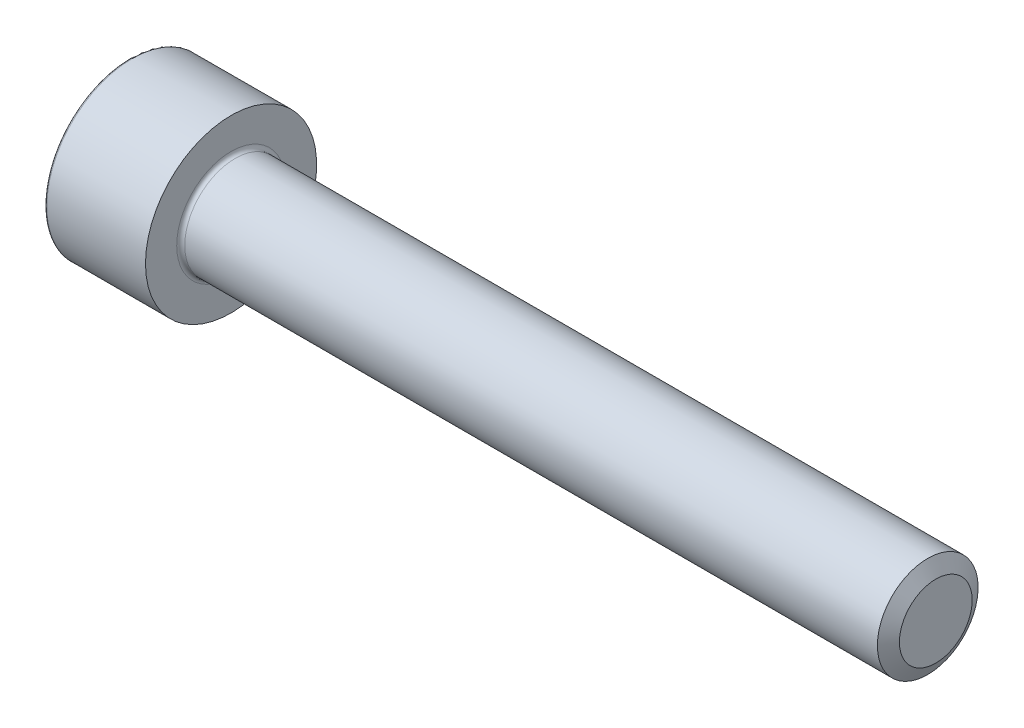
ISO-10303-21;
HEADER;
FILE_DESCRIPTION(('STEP AP214'),'2;1');
FILE_NAME('part.step','',(''),(''),'','','');
FILE_SCHEMA(('AUTOMOTIVE_DESIGN { 1 0 10303 214 1 1 1 1 }'));
ENDSEC;
DATA;
#1=APPLICATION_CONTEXT('core data for automotive mechanical design processes');
#2=APPLICATION_PROTOCOL_DEFINITION('international standard','automotive_design',2000,#1);
#3=PRODUCT_CONTEXT('',#1,'mechanical');
#4=PRODUCT('Part','Part','',(#3));
#5=PRODUCT_RELATED_PRODUCT_CATEGORY('part','',(#4));
#6=PRODUCT_DEFINITION_FORMATION('','',#4);
#7=PRODUCT_DEFINITION_CONTEXT('part definition',#1,'design');
#8=PRODUCT_DEFINITION('design','',#6,#7);
#9=PRODUCT_DEFINITION_SHAPE('','',#8);
#10=(LENGTH_UNIT() NAMED_UNIT(*) SI_UNIT(.MILLI.,.METRE.));
#11=(NAMED_UNIT(*) PLANE_ANGLE_UNIT() SI_UNIT($,.RADIAN.));
#12=(NAMED_UNIT(*) SI_UNIT($,.STERADIAN.) SOLID_ANGLE_UNIT());
#13=UNCERTAINTY_MEASURE_WITH_UNIT(LENGTH_MEASURE(1.E-05),#10,'distance_accuracy_value','');
#14=(GEOMETRIC_REPRESENTATION_CONTEXT(3) GLOBAL_UNCERTAINTY_ASSIGNED_CONTEXT((#13)) GLOBAL_UNIT_ASSIGNED_CONTEXT((#10,
#11,#12)) REPRESENTATION_CONTEXT('',''));
#15=CARTESIAN_POINT('',(0.,0.,0.));
#16=DIRECTION('',(0.,0.,1.));
#17=DIRECTION('',(1.,0.,0.));
#18=AXIS2_PLACEMENT_3D('',#15,#16,#17);
#19=CARTESIAN_POINT('',(0.,0.,0.));
#20=DIRECTION('',(-1.,0.,0.));
#21=DIRECTION('',(0.,0.,1.));
#22=AXIS2_PLACEMENT_3D('',#19,#20,#21);
#23=CYLINDRICAL_SURFACE('',#22,2.5);
#24=CARTESIAN_POINT('',(5.2,0.,0.));
#25=DIRECTION('',(-1.,0.,0.));
#26=DIRECTION('',(0.,0.,1.));
#27=AXIS2_PLACEMENT_3D('',#24,#25,#26);
#28=CIRCLE('',#27,2.5);
#29=CARTESIAN_POINT('',(5.2,0.,2.5));
#30=VERTEX_POINT('',#29);
#31=EDGE_CURVE('E148',#30,#30,#28,.T.);
#32=ORIENTED_EDGE('',*,*,#31,.F.);
#33=EDGE_LOOP('',(#32));
#34=FACE_BOUND('',#33,.T.);
#35=CARTESIAN_POINT('',(39.6000117335054,0.,0.));
#36=DIRECTION('',(-1.,0.,0.));
#37=DIRECTION('',(0.,0.,1.));
#38=AXIS2_PLACEMENT_3D('',#35,#36,#37);
#39=CIRCLE('',#38,2.5);
#40=CARTESIAN_POINT('',(39.6000117335054,0.,2.5));
#41=VERTEX_POINT('',#40);
#42=EDGE_CURVE('E285',#41,#41,#39,.T.);
#43=ORIENTED_EDGE('',*,*,#42,.T.);
#44=EDGE_LOOP('',(#43));
#45=FACE_BOUND('',#44,.T.);
#46=ADVANCED_FACE('F45',(#34,#45),#23,.T.);
#47=CARTESIAN_POINT('',(0.,0.,0.));
#48=DIRECTION('',(1.,0.,0.));
#49=DIRECTION('',(0.,0.,-1.));
#50=AXIS2_PLACEMENT_3D('',#47,#48,#49);
#51=PLANE('',#50);
#52=CARTESIAN_POINT('',(0.,0.,0.));
#53=DIRECTION('',(1.,0.,0.));
#54=DIRECTION('',(0.,0.,-1.));
#55=AXIS2_PLACEMENT_3D('',#52,#53,#54);
#56=CIRCLE('',#55,4.15);
#57=CARTESIAN_POINT('',(0.,0.,-4.15));
#58=VERTEX_POINT('',#57);
#59=EDGE_CURVE('E53',#58,#58,#56,.F.);
#60=ORIENTED_EDGE('',*,*,#59,.T.);
#61=EDGE_LOOP('',(#60));
#62=FACE_BOUND('',#61,.T.);
#63=DIRECTION('',(0.,0.866025403784439,-0.5));
#64=VECTOR('',#63,1.);
#65=CARTESIAN_POINT('',(0.,0.,2.29));
#66=LINE('',#65,#64);
#67=CARTESIAN_POINT('',(0.,0.,2.29));
#68=VERTEX_POINT('',#67);
#69=CARTESIAN_POINT('',(0.,1.98319817466637,1.145));
#70=VERTEX_POINT('',#69);
#71=EDGE_CURVE('E134',#68,#70,#66,.T.);
#72=ORIENTED_EDGE('',*,*,#71,.F.);
#73=DIRECTION('',(0.,0.866025403784439,0.5));
#74=VECTOR('',#73,1.);
#75=CARTESIAN_POINT('',(0.,-1.98319817466637,1.145));
#76=LINE('',#75,#74);
#77=CARTESIAN_POINT('',(0.,-1.98319817466637,1.145));
#78=VERTEX_POINT('',#77);
#79=EDGE_CURVE('E60',#78,#68,#76,.T.);
#80=ORIENTED_EDGE('',*,*,#79,.F.);
#81=DIRECTION('',(0.,0.,1.));
#82=VECTOR('',#81,1.);
#83=CARTESIAN_POINT('',(0.,-1.98319817466636,-1.145));
#84=LINE('',#83,#82);
#85=CARTESIAN_POINT('',(0.,-1.98319817466636,-1.145));
#86=VERTEX_POINT('',#85);
#87=EDGE_CURVE('E144',#86,#78,#84,.T.);
#88=ORIENTED_EDGE('',*,*,#87,.F.);
#89=DIRECTION('',(0.,-0.866025403784438,0.5));
#90=VECTOR('',#89,1.);
#91=CARTESIAN_POINT('',(0.,0.,-2.29));
#92=LINE('',#91,#90);
#93=CARTESIAN_POINT('',(0.,0.,-2.29));
#94=VERTEX_POINT('',#93);
#95=EDGE_CURVE('E142',#94,#86,#92,.T.);
#96=ORIENTED_EDGE('',*,*,#95,.F.);
#97=DIRECTION('',(0.,-0.866025403784439,-0.5));
#98=VECTOR('',#97,1.);
#99=CARTESIAN_POINT('',(0.,1.98319817466636,-1.145));
#100=LINE('',#99,#98);
#101=CARTESIAN_POINT('',(0.,1.98319817466636,-1.145));
#102=VERTEX_POINT('',#101);
#103=EDGE_CURVE('E108',#102,#94,#100,.T.);
#104=ORIENTED_EDGE('',*,*,#103,.F.);
#105=DIRECTION('',(0.,0.,-1.));
#106=VECTOR('',#105,1.);
#107=CARTESIAN_POINT('',(0.,1.98319817466637,1.145));
#108=LINE('',#107,#106);
#109=EDGE_CURVE('E138',#70,#102,#108,.T.);
#110=ORIENTED_EDGE('',*,*,#109,.F.);
#111=EDGE_LOOP('',(#72,#80,#88,#96,#104,#110));
#112=FACE_BOUND('',#111,.T.);
#113=ADVANCED_FACE('F165',(#62,#112),#51,.F.);
#114=CARTESIAN_POINT('',(0.,0.,0.));
#115=DIRECTION('',(-1.,0.,0.));
#116=DIRECTION('',(0.,0.,1.));
#117=AXIS2_PLACEMENT_3D('',#114,#115,#116);
#118=CYLINDRICAL_SURFACE('',#117,4.25);
#119=CARTESIAN_POINT('',(0.1,0.,0.));
#120=DIRECTION('',(1.,0.,0.));
#121=DIRECTION('',(0.,0.,-1.));
#122=AXIS2_PLACEMENT_3D('',#119,#120,#121);
#123=CIRCLE('',#122,4.25);
#124=CARTESIAN_POINT('',(0.1,0.,-4.25));
#125=VERTEX_POINT('',#124);
#126=EDGE_CURVE('E11',#125,#125,#123,.T.);
#127=ORIENTED_EDGE('',*,*,#126,.T.);
#128=EDGE_LOOP('',(#127));
#129=FACE_BOUND('',#128,.T.);
#130=CARTESIAN_POINT('',(5.,0.,0.));
#131=DIRECTION('',(-1.,0.,0.));
#132=DIRECTION('',(0.,0.,1.));
#133=AXIS2_PLACEMENT_3D('',#130,#131,#132);
#134=CIRCLE('',#133,4.25);
#135=CARTESIAN_POINT('',(5.,0.,4.25));
#136=VERTEX_POINT('',#135);
#137=EDGE_CURVE('E159',#136,#136,#134,.T.);
#138=ORIENTED_EDGE('',*,*,#137,.T.);
#139=EDGE_LOOP('',(#138));
#140=FACE_BOUND('',#139,.T.);
#141=ADVANCED_FACE('F184',(#129,#140),#118,.T.);
#142=CARTESIAN_POINT('',(5.,4.25,0.));
#143=DIRECTION('',(-1.,0.,0.));
#144=DIRECTION('',(0.,0.,1.));
#145=AXIS2_PLACEMENT_3D('',#142,#143,#144);
#146=PLANE('',#145);
#147=ORIENTED_EDGE('',*,*,#137,.F.);
#148=EDGE_LOOP('',(#147));
#149=FACE_BOUND('',#148,.T.);
#150=CARTESIAN_POINT('',(5.,0.,0.));
#151=DIRECTION('',(-1.,0.,0.));
#152=DIRECTION('',(0.,0.,1.));
#153=AXIS2_PLACEMENT_3D('',#150,#151,#152);
#154=CIRCLE('',#153,2.7);
#155=CARTESIAN_POINT('',(5.,0.,2.7));
#156=VERTEX_POINT('',#155);
#157=EDGE_CURVE('E156',#156,#156,#154,.T.);
#158=ORIENTED_EDGE('',*,*,#157,.T.);
#159=EDGE_LOOP('',(#158));
#160=FACE_BOUND('',#159,.T.);
#161=ADVANCED_FACE('F193',(#149,#160),#146,.F.);
#162=CARTESIAN_POINT('',(5.2,0.,0.));
#163=DIRECTION('',(-1.,0.,0.));
#164=DIRECTION('',(0.,0.,1.));
#165=AXIS2_PLACEMENT_3D('',#162,#163,#164);
#166=TOROIDAL_SURFACE('',#165,2.7,0.2);
#167=ORIENTED_EDGE('',*,*,#157,.F.);
#168=EDGE_LOOP('',(#167));
#169=FACE_BOUND('',#168,.T.);
#170=ORIENTED_EDGE('',*,*,#31,.T.);
#171=EDGE_LOOP('',(#170));
#172=FACE_BOUND('',#171,.T.);
#173=ADVANCED_FACE('F189',(#169,#172),#166,.F.);
#174=CARTESIAN_POINT('',(2.5,-1.98319817466637,1.145));
#175=DIRECTION('',(0.,-0.5,0.866025403784439));
#176=DIRECTION('',(0.,-0.866025403784439,-0.5));
#177=AXIS2_PLACEMENT_3D('',#174,#175,#176);
#178=PLANE('',#177);
#179=ORIENTED_EDGE('',*,*,#79,.T.);
#180=DIRECTION('',(-1.,0.,0.));
#181=VECTOR('',#180,1.);
#182=CARTESIAN_POINT('',(2.5,0.,2.29));
#183=LINE('',#182,#181);
#184=CARTESIAN_POINT('',(2.5,0.,2.29));
#185=VERTEX_POINT('',#184);
#186=EDGE_CURVE('E90',#185,#68,#183,.T.);
#187=ORIENTED_EDGE('',*,*,#186,.F.);
#188=DIRECTION('',(0.,0.866025403784439,0.5));
#189=VECTOR('',#188,1.);
#190=CARTESIAN_POINT('',(2.5,-1.98319817466637,1.145));
#191=LINE('',#190,#189);
#192=CARTESIAN_POINT('',(2.5,-1.98319817466637,1.145));
#193=VERTEX_POINT('',#192);
#194=EDGE_CURVE('E146',#193,#185,#191,.T.);
#195=ORIENTED_EDGE('',*,*,#194,.F.);
#196=DIRECTION('',(-1.,0.,0.));
#197=VECTOR('',#196,1.);
#198=CARTESIAN_POINT('',(2.5,-1.98319817466637,1.145));
#199=LINE('',#198,#197);
#200=EDGE_CURVE('E68',#193,#78,#199,.T.);
#201=ORIENTED_EDGE('',*,*,#200,.T.);
#202=EDGE_LOOP('',(#179,#187,#195,#201));
#203=FACE_BOUND('',#202,.T.);
#204=ADVANCED_FACE('F192',(#203),#178,.F.);
#205=CARTESIAN_POINT('',(2.5,-1.98319817466636,-1.145));
#206=DIRECTION('',(0.,-1.,0.));
#207=DIRECTION('',(0.,0.,-1.));
#208=AXIS2_PLACEMENT_3D('',#205,#206,#207);
#209=PLANE('',#208);
#210=ORIENTED_EDGE('',*,*,#87,.T.);
#211=ORIENTED_EDGE('',*,*,#200,.F.);
#212=DIRECTION('',(0.,0.,1.));
#213=VECTOR('',#212,1.);
#214=CARTESIAN_POINT('',(2.5,-1.98319817466636,-1.145));
#215=LINE('',#214,#213);
#216=CARTESIAN_POINT('',(2.5,-1.98319817466636,-1.145));
#217=VERTEX_POINT('',#216);
#218=EDGE_CURVE('E120',#217,#193,#215,.T.);
#219=ORIENTED_EDGE('',*,*,#218,.F.);
#220=DIRECTION('',(-1.,0.,0.));
#221=VECTOR('',#220,1.);
#222=CARTESIAN_POINT('',(2.5,-1.98319817466636,-1.145));
#223=LINE('',#222,#221);
#224=EDGE_CURVE('E112',#217,#86,#223,.T.);
#225=ORIENTED_EDGE('',*,*,#224,.T.);
#226=EDGE_LOOP('',(#210,#211,#219,#225));
#227=FACE_BOUND('',#226,.T.);
#228=ADVANCED_FACE('F223',(#227),#209,.F.);
#229=CARTESIAN_POINT('',(2.5,0.,-2.29));
#230=DIRECTION('',(0.,-0.5,-0.866025403784439));
#231=DIRECTION('',(0.,0.866025403784439,-0.5));
#232=AXIS2_PLACEMENT_3D('',#229,#230,#231);
#233=PLANE('',#232);
#234=ORIENTED_EDGE('',*,*,#95,.T.);
#235=ORIENTED_EDGE('',*,*,#224,.F.);
#236=DIRECTION('',(0.,-0.866025403784438,0.5));
#237=VECTOR('',#236,1.);
#238=CARTESIAN_POINT('',(2.5,0.,-2.29));
#239=LINE('',#238,#237);
#240=CARTESIAN_POINT('',(2.5,0.,-2.29));
#241=VERTEX_POINT('',#240);
#242=EDGE_CURVE('E116',#241,#217,#239,.T.);
#243=ORIENTED_EDGE('',*,*,#242,.F.);
#244=DIRECTION('',(-1.,0.,0.));
#245=VECTOR('',#244,1.);
#246=CARTESIAN_POINT('',(2.5,0.,-2.29));
#247=LINE('',#246,#245);
#248=EDGE_CURVE('E101',#241,#94,#247,.T.);
#249=ORIENTED_EDGE('',*,*,#248,.T.);
#250=EDGE_LOOP('',(#234,#235,#243,#249));
#251=FACE_BOUND('',#250,.T.);
#252=ADVANCED_FACE('F117',(#251),#233,.F.);
#253=CARTESIAN_POINT('',(2.5,1.98319817466636,-1.145));
#254=DIRECTION('',(0.,0.5,-0.866025403784439));
#255=DIRECTION('',(0.,0.866025403784439,0.5));
#256=AXIS2_PLACEMENT_3D('',#253,#254,#255);
#257=PLANE('',#256);
#258=ORIENTED_EDGE('',*,*,#103,.T.);
#259=ORIENTED_EDGE('',*,*,#248,.F.);
#260=DIRECTION('',(0.,-0.866025403784439,-0.5));
#261=VECTOR('',#260,1.);
#262=CARTESIAN_POINT('',(2.5,1.98319817466636,-1.145));
#263=LINE('',#262,#261);
#264=CARTESIAN_POINT('',(2.5,1.98319817466636,-1.145));
#265=VERTEX_POINT('',#264);
#266=EDGE_CURVE('E105',#265,#241,#263,.T.);
#267=ORIENTED_EDGE('',*,*,#266,.F.);
#268=DIRECTION('',(-1.,0.,0.));
#269=VECTOR('',#268,1.);
#270=CARTESIAN_POINT('',(2.5,1.98319817466636,-1.145));
#271=LINE('',#270,#269);
#272=EDGE_CURVE('E113',#265,#102,#271,.T.);
#273=ORIENTED_EDGE('',*,*,#272,.T.);
#274=EDGE_LOOP('',(#258,#259,#267,#273));
#275=FACE_BOUND('',#274,.T.);
#276=ADVANCED_FACE('F103',(#275),#257,.F.);
#277=CARTESIAN_POINT('',(2.5,1.98319817466637,1.145));
#278=DIRECTION('',(0.,1.,0.));
#279=DIRECTION('',(0.,0.,1.));
#280=AXIS2_PLACEMENT_3D('',#277,#278,#279);
#281=PLANE('',#280);
#282=ORIENTED_EDGE('',*,*,#109,.T.);
#283=ORIENTED_EDGE('',*,*,#272,.F.);
#284=DIRECTION('',(0.,0.,-1.));
#285=VECTOR('',#284,1.);
#286=CARTESIAN_POINT('',(2.5,1.98319817466637,1.145));
#287=LINE('',#286,#285);
#288=CARTESIAN_POINT('',(2.5,1.98319817466637,1.145));
#289=VERTEX_POINT('',#288);
#290=EDGE_CURVE('E126',#289,#265,#287,.T.);
#291=ORIENTED_EDGE('',*,*,#290,.F.);
#292=DIRECTION('',(-1.,0.,0.));
#293=VECTOR('',#292,1.);
#294=CARTESIAN_POINT('',(2.5,1.98319817466637,1.145));
#295=LINE('',#294,#293);
#296=EDGE_CURVE('E151',#289,#70,#295,.T.);
#297=ORIENTED_EDGE('',*,*,#296,.T.);
#298=EDGE_LOOP('',(#282,#283,#291,#297));
#299=FACE_BOUND('',#298,.T.);
#300=ADVANCED_FACE('F241',(#299),#281,.F.);
#301=CARTESIAN_POINT('',(2.5,0.,2.29));
#302=DIRECTION('',(0.,0.5,0.866025403784438));
#303=DIRECTION('',(0.,-0.866025403784439,0.5));
#304=AXIS2_PLACEMENT_3D('',#301,#302,#303);
#305=PLANE('',#304);
#306=ORIENTED_EDGE('',*,*,#71,.T.);
#307=ORIENTED_EDGE('',*,*,#296,.F.);
#308=DIRECTION('',(0.,0.866025403784439,-0.5));
#309=VECTOR('',#308,1.);
#310=CARTESIAN_POINT('',(2.5,0.,2.29));
#311=LINE('',#310,#309);
#312=EDGE_CURVE('E128',#185,#289,#311,.T.);
#313=ORIENTED_EDGE('',*,*,#312,.F.);
#314=ORIENTED_EDGE('',*,*,#186,.T.);
#315=EDGE_LOOP('',(#306,#307,#313,#314));
#316=FACE_BOUND('',#315,.T.);
#317=ADVANCED_FACE('F248',(#316),#305,.F.);
#318=CARTESIAN_POINT('',(2.5,-1.98319817466637,1.145));
#319=DIRECTION('',(1.,0.,0.));
#320=DIRECTION('',(0.,0.,-1.));
#321=AXIS2_PLACEMENT_3D('',#318,#319,#320);
#322=PLANE('',#321);
#323=ORIENTED_EDGE('',*,*,#194,.T.);
#324=ORIENTED_EDGE('',*,*,#312,.T.);
#325=ORIENTED_EDGE('',*,*,#290,.T.);
#326=ORIENTED_EDGE('',*,*,#266,.T.);
#327=ORIENTED_EDGE('',*,*,#242,.T.);
#328=ORIENTED_EDGE('',*,*,#218,.T.);
#329=EDGE_LOOP('',(#323,#324,#325,#326,#327,#328));
#330=FACE_BOUND('',#329,.T.);
#331=ADVANCED_FACE('F123',(#330),#322,.F.);
#332=CARTESIAN_POINT('',(39.6000117335054,0.,0.));
#333=DIRECTION('',(-1.,0.,0.));
#334=DIRECTION('',(0.,0.,1.));
#335=AXIS2_PLACEMENT_3D('',#332,#333,#334);
#336=CONICAL_SURFACE('',#335,2.5,1.04719755119658);
#337=CARTESIAN_POINT('',(40.,0.,0.));
#338=DIRECTION('',(-1.,0.,0.));
#339=DIRECTION('',(0.,0.,1.));
#340=AXIS2_PLACEMENT_3D('',#337,#338,#339);
#341=CIRCLE('',#340,1.8072);
#342=CARTESIAN_POINT('',(40.,0.,1.8072));
#343=VERTEX_POINT('',#342);
#344=EDGE_CURVE('E135',#343,#343,#341,.T.);
#345=ORIENTED_EDGE('',*,*,#344,.T.);
#346=EDGE_LOOP('',(#345));
#347=FACE_BOUND('',#346,.T.);
#348=ORIENTED_EDGE('',*,*,#42,.F.);
#349=EDGE_LOOP('',(#348));
#350=FACE_BOUND('',#349,.T.);
#351=ADVANCED_FACE('F174',(#347,#350),#336,.T.);
#352=CARTESIAN_POINT('',(40.,2.5,0.));
#353=DIRECTION('',(-1.,0.,0.));
#354=DIRECTION('',(0.,0.,1.));
#355=AXIS2_PLACEMENT_3D('',#352,#353,#354);
#356=PLANE('',#355);
#357=ORIENTED_EDGE('',*,*,#344,.F.);
#358=EDGE_LOOP('',(#357));
#359=FACE_BOUND('',#358,.T.);
#360=ADVANCED_FACE('F169',(#359),#356,.F.);
#361=CARTESIAN_POINT('',(0.1,0.,0.));
#362=DIRECTION('',(1.,0.,0.));
#363=DIRECTION('',(0.,0.,-1.));
#364=AXIS2_PLACEMENT_3D('',#361,#362,#363);
#365=TOROIDAL_SURFACE('',#364,4.15,0.1);
#366=ORIENTED_EDGE('',*,*,#126,.F.);
#367=EDGE_LOOP('',(#366));
#368=FACE_BOUND('',#367,.T.);
#369=ORIENTED_EDGE('',*,*,#59,.F.);
#370=EDGE_LOOP('',(#369));
#371=FACE_BOUND('',#370,.T.);
#372=ADVANCED_FACE('F47',(#368,#371),#365,.T.);
#373=CLOSED_SHELL('',(#46,#113,#141,#161,#173,#204,#228,#252,#276,#300,#317,#331,#351,#360,#372));
#374=MANIFOLD_SOLID_BREP('B2',#373);
#375=ADVANCED_BREP_SHAPE_REPRESENTATION('',(#18,#374),#14);
#376=SHAPE_DEFINITION_REPRESENTATION(#9,#375);
ENDSEC;
END-ISO-10303-21;
